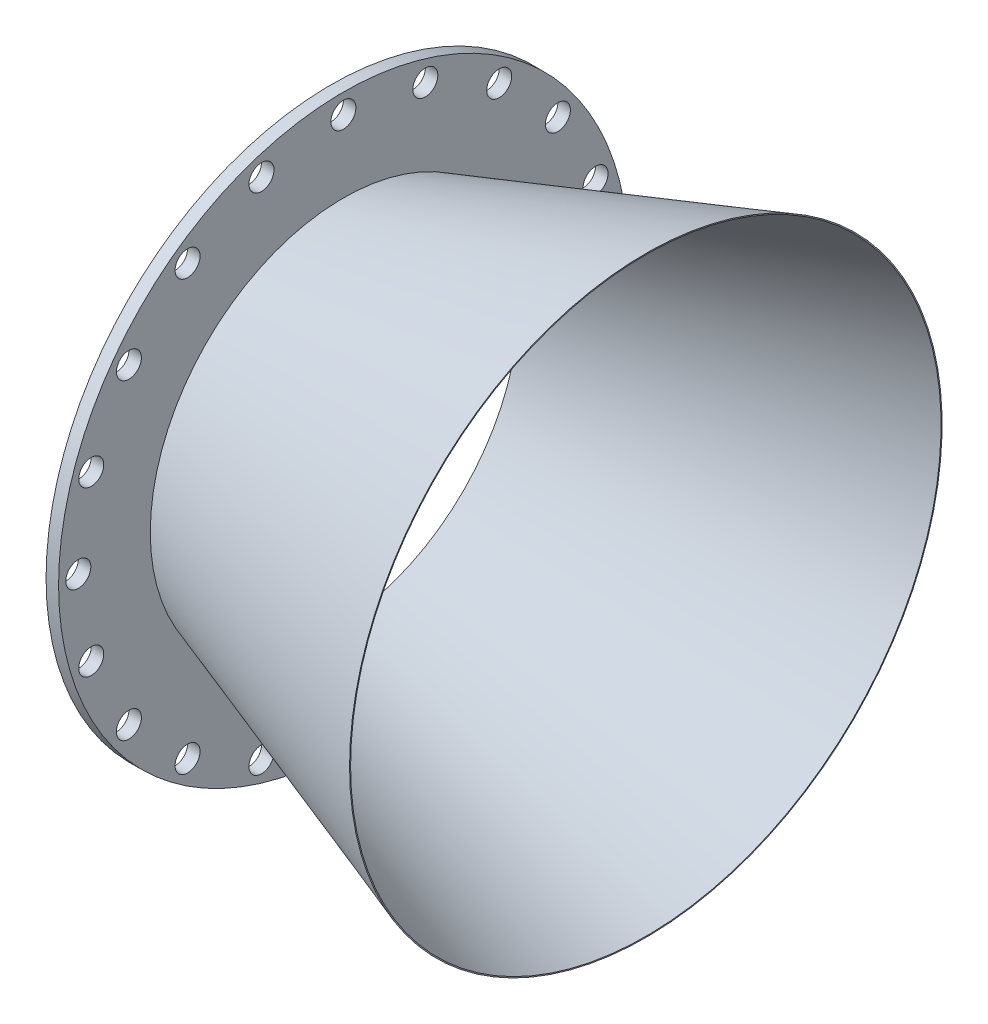
ISO-10303-21;
HEADER;
FILE_DESCRIPTION(('STEP AP214'),'2;1');
FILE_NAME('part.step','',(''),(''),'','','');
FILE_SCHEMA(('AUTOMOTIVE_DESIGN { 1 0 10303 214 1 1 1 1 }'));
ENDSEC;
DATA;
#1=APPLICATION_CONTEXT('core data for automotive mechanical design processes');
#2=APPLICATION_PROTOCOL_DEFINITION('international standard','automotive_design',2000,#1);
#3=PRODUCT_CONTEXT('',#1,'mechanical');
#4=PRODUCT('Part','Part','',(#3));
#5=PRODUCT_RELATED_PRODUCT_CATEGORY('part','',(#4));
#6=PRODUCT_DEFINITION_FORMATION('','',#4);
#7=PRODUCT_DEFINITION_CONTEXT('part definition',#1,'design');
#8=PRODUCT_DEFINITION('design','',#6,#7);
#9=PRODUCT_DEFINITION_SHAPE('','',#8);
#10=(LENGTH_UNIT() NAMED_UNIT(*) SI_UNIT(.MILLI.,.METRE.));
#11=(NAMED_UNIT(*) PLANE_ANGLE_UNIT() SI_UNIT($,.RADIAN.));
#12=(NAMED_UNIT(*) SI_UNIT($,.STERADIAN.) SOLID_ANGLE_UNIT());
#13=UNCERTAINTY_MEASURE_WITH_UNIT(LENGTH_MEASURE(1.E-05),#10,'distance_accuracy_value','');
#14=(GEOMETRIC_REPRESENTATION_CONTEXT(3) GLOBAL_UNCERTAINTY_ASSIGNED_CONTEXT((#13)) GLOBAL_UNIT_ASSIGNED_CONTEXT((#10,
#11,#12)) REPRESENTATION_CONTEXT('',''));
#15=CARTESIAN_POINT('',(0.,0.,0.));
#16=DIRECTION('',(0.,0.,1.));
#17=DIRECTION('',(1.,0.,0.));
#18=AXIS2_PLACEMENT_3D('',#15,#16,#17);
#19=CARTESIAN_POINT('',(79.9592,0.,0.));
#20=DIRECTION('',(1.,0.,0.));
#21=DIRECTION('',(0.,0.,-1.));
#22=AXIS2_PLACEMENT_3D('',#19,#20,#21);
#23=CONICAL_SURFACE('',#22,75.2237755254414,0.328785996406436);
#24=CARTESIAN_POINT('',(79.9592,0.,0.));
#25=DIRECTION('',(-1.,0.,0.));
#26=DIRECTION('',(0.,0.,1.));
#27=AXIS2_PLACEMENT_3D('',#24,#25,#26);
#28=CIRCLE('',#27,75.2237755254414);
#29=CARTESIAN_POINT('',(79.9592,0.,75.2237755254414));
#30=VERTEX_POINT('',#29);
#31=EDGE_CURVE('E41',#30,#30,#28,.T.);
#32=ORIENTED_EDGE('',*,*,#31,.T.);
#33=EDGE_LOOP('',(#32));
#34=FACE_BOUND('',#33,.T.);
#35=CARTESIAN_POINT('',(3.175,0.,0.));
#36=DIRECTION('',(-1.,0.,0.));
#37=DIRECTION('',(0.,0.,1.));
#38=AXIS2_PLACEMENT_3D('',#35,#36,#37);
#39=CIRCLE('',#38,49.0273870883385);
#40=CARTESIAN_POINT('',(3.175,0.,49.0273870883385));
#41=VERTEX_POINT('',#40);
#42=EDGE_CURVE('E10',#41,#41,#39,.T.);
#43=ORIENTED_EDGE('',*,*,#42,.F.);
#44=EDGE_LOOP('',(#43));
#45=FACE_BOUND('',#44,.T.);
#46=ADVANCED_FACE('F34',(#34,#45),#23,.T.);
#47=CARTESIAN_POINT('',(0.,47.6758,0.));
#48=DIRECTION('',(1.,0.,0.));
#49=DIRECTION('',(0.,0.,-1.));
#50=AXIS2_PLACEMENT_3D('',#47,#48,#49);
#51=PLANE('',#50);
#52=CARTESIAN_POINT('',(0.,20.7999338913742,-64.0156141118243));
#53=DIRECTION('',(-1.,0.,0.));
#54=DIRECTION('',(0.,0.,1.));
#55=AXIS2_PLACEMENT_3D('',#52,#53,#54);
#56=CIRCLE('',#55,3.175);
#57=CARTESIAN_POINT('',(0.,20.7999338913742,-60.8406141118243));
#58=VERTEX_POINT('',#57);
#59=EDGE_CURVE('E115',#58,#58,#56,.T.);
#60=ORIENTED_EDGE('',*,*,#59,.F.);
#61=EDGE_LOOP('',(#60));
#62=FACE_BOUND('',#61,.T.);
#63=CARTESIAN_POINT('',(0.,-3.67824881138597E-12,-67.3099999999963));
#64=DIRECTION('',(-1.,0.,0.));
#65=DIRECTION('',(0.,0.,1.));
#66=AXIS2_PLACEMENT_3D('',#63,#64,#65);
#67=CIRCLE('',#66,3.175);
#68=CARTESIAN_POINT('',(0.,-3.67824881138597E-12,-64.1349999999963));
#69=VERTEX_POINT('',#68);
#70=EDGE_CURVE('E123',#69,#69,#67,.T.);
#71=ORIENTED_EDGE('',*,*,#70,.F.);
#72=EDGE_LOOP('',(#71));
#73=FACE_BOUND('',#72,.T.);
#74=CARTESIAN_POINT('',(0.,-20.7999338913812,-64.015614111822));
#75=DIRECTION('',(-1.,0.,0.));
#76=DIRECTION('',(0.,0.,1.));
#77=AXIS2_PLACEMENT_3D('',#74,#75,#76);
#78=CIRCLE('',#77,3.175);
#79=CARTESIAN_POINT('',(0.,-20.7999338913812,-60.840614111822));
#80=VERTEX_POINT('',#79);
#81=EDGE_CURVE('E129',#80,#80,#78,.T.);
#82=ORIENTED_EDGE('',*,*,#81,.F.);
#83=EDGE_LOOP('',(#82));
#84=FACE_BOUND('',#83,.T.);
#85=CARTESIAN_POINT('',(0.,-39.5638253318093,-54.4549338913719));
#86=DIRECTION('',(-1.,0.,0.));
#87=DIRECTION('',(0.,0.,1.));
#88=AXIS2_PLACEMENT_3D('',#85,#86,#87);
#89=CIRCLE('',#88,3.175);
#90=CARTESIAN_POINT('',(0.,-39.5638253318093,-51.2799338913719));
#91=VERTEX_POINT('',#90);
#92=EDGE_CURVE('E135',#91,#91,#89,.T.);
#93=ORIENTED_EDGE('',*,*,#92,.F.);
#94=EDGE_LOOP('',(#93));
#95=FACE_BOUND('',#94,.T.);
#96=CARTESIAN_POINT('',(0.,-54.4549338913799,-39.5638253317997));
#97=DIRECTION('',(-1.,0.,0.));
#98=DIRECTION('',(0.,0.,1.));
#99=AXIS2_PLACEMENT_3D('',#96,#97,#98);
#100=CIRCLE('',#99,3.175);
#101=CARTESIAN_POINT('',(0.,-54.4549338913799,-36.3888253317997));
#102=VERTEX_POINT('',#101);
#103=EDGE_CURVE('E141',#102,#102,#100,.T.);
#104=ORIENTED_EDGE('',*,*,#103,.F.);
#105=EDGE_LOOP('',(#104));
#106=FACE_BOUND('',#105,.T.);
#107=CARTESIAN_POINT('',(0.,-64.0156141118279,-20.7999338913705));
#108=DIRECTION('',(-1.,0.,0.));
#109=DIRECTION('',(0.,0.,1.));
#110=AXIS2_PLACEMENT_3D('',#107,#108,#109);
#111=CIRCLE('',#110,3.175);
#112=CARTESIAN_POINT('',(0.,-64.0156141118279,-17.6249338913705));
#113=VERTEX_POINT('',#112);
#114=EDGE_CURVE('E147',#113,#113,#111,.T.);
#115=ORIENTED_EDGE('',*,*,#114,.F.);
#116=EDGE_LOOP('',(#115));
#117=FACE_BOUND('',#116,.T.);
#118=CARTESIAN_POINT('',(0.,-67.31,7.34001142756182E-12));
#119=DIRECTION('',(-1.,0.,0.));
#120=DIRECTION('',(0.,0.,1.));
#121=AXIS2_PLACEMENT_3D('',#118,#119,#120);
#122=CIRCLE('',#121,3.175);
#123=CARTESIAN_POINT('',(0.,-67.31,3.17500000000734));
#124=VERTEX_POINT('',#123);
#125=EDGE_CURVE('E153',#124,#124,#122,.T.);
#126=ORIENTED_EDGE('',*,*,#125,.F.);
#127=EDGE_LOOP('',(#126));
#128=FACE_BOUND('',#127,.T.);
#129=CARTESIAN_POINT('',(0.,-64.0156141118256,20.7999338913849));
#130=DIRECTION('',(-1.,0.,0.));
#131=DIRECTION('',(0.,0.,1.));
#132=AXIS2_PLACEMENT_3D('',#129,#130,#131);
#133=CIRCLE('',#132,3.175);
#134=CARTESIAN_POINT('',(0.,-64.0156141118256,23.9749338913849));
#135=VERTEX_POINT('',#134);
#136=EDGE_CURVE('E74',#135,#135,#133,.T.);
#137=ORIENTED_EDGE('',*,*,#136,.F.);
#138=EDGE_LOOP('',(#137));
#139=FACE_BOUND('',#138,.T.);
#140=CARTESIAN_POINT('',(0.,-54.4549338913755,39.563825331813));
#141=DIRECTION('',(-1.,0.,0.));
#142=DIRECTION('',(0.,0.,1.));
#143=AXIS2_PLACEMENT_3D('',#140,#141,#142);
#144=CIRCLE('',#143,3.175);
#145=CARTESIAN_POINT('',(0.,-54.4549338913755,42.738825331813));
#146=VERTEX_POINT('',#145);
#147=EDGE_CURVE('E67',#146,#146,#144,.T.);
#148=ORIENTED_EDGE('',*,*,#147,.F.);
#149=EDGE_LOOP('',(#148));
#150=FACE_BOUND('',#149,.T.);
#151=CARTESIAN_POINT('',(0.,-39.5638253318034,54.4549338913835));
#152=DIRECTION('',(-1.,0.,0.));
#153=DIRECTION('',(0.,0.,1.));
#154=AXIS2_PLACEMENT_3D('',#151,#152,#153);
#155=CIRCLE('',#154,3.175);
#156=CARTESIAN_POINT('',(0.,-39.5638253318034,57.6299338913835));
#157=VERTEX_POINT('',#156);
#158=EDGE_CURVE('E75',#157,#157,#155,.T.);
#159=ORIENTED_EDGE('',*,*,#158,.F.);
#160=EDGE_LOOP('',(#159));
#161=FACE_BOUND('',#160,.T.);
#162=CARTESIAN_POINT('',(0.,-20.7999338913742,64.0156141118316));
#163=DIRECTION('',(-1.,0.,0.));
#164=DIRECTION('',(0.,0.,1.));
#165=AXIS2_PLACEMENT_3D('',#162,#163,#164);
#166=CIRCLE('',#165,3.175);
#167=CARTESIAN_POINT('',(0.,-20.7999338913742,67.1906141118316));
#168=VERTEX_POINT('',#167);
#169=EDGE_CURVE('E81',#168,#168,#166,.T.);
#170=ORIENTED_EDGE('',*,*,#169,.F.);
#171=EDGE_LOOP('',(#170));
#172=FACE_BOUND('',#171,.T.);
#173=CARTESIAN_POINT('',(0.,3.67000571378091E-12,67.3100000000037));
#174=DIRECTION('',(-1.,0.,0.));
#175=DIRECTION('',(0.,0.,1.));
#176=AXIS2_PLACEMENT_3D('',#173,#174,#175);
#177=CIRCLE('',#176,3.175);
#178=CARTESIAN_POINT('',(0.,3.67000571378091E-12,70.4850000000037));
#179=VERTEX_POINT('',#178);
#180=EDGE_CURVE('E87',#179,#179,#177,.T.);
#181=ORIENTED_EDGE('',*,*,#180,.F.);
#182=EDGE_LOOP('',(#181));
#183=FACE_BOUND('',#182,.T.);
#184=CARTESIAN_POINT('',(0.,20.7999338913812,64.0156141118293));
#185=DIRECTION('',(-1.,0.,0.));
#186=DIRECTION('',(0.,0.,1.));
#187=AXIS2_PLACEMENT_3D('',#184,#185,#186);
#188=CIRCLE('',#187,3.17500000000001);
#189=CARTESIAN_POINT('',(0.,20.7999338913812,67.1906141118293));
#190=VERTEX_POINT('',#189);
#191=EDGE_CURVE('E93',#190,#190,#188,.T.);
#192=ORIENTED_EDGE('',*,*,#191,.F.);
#193=EDGE_LOOP('',(#192));
#194=FACE_BOUND('',#193,.T.);
#195=CARTESIAN_POINT('',(0.,39.5638253318093,54.4549338913792));
#196=DIRECTION('',(-1.,0.,0.));
#197=DIRECTION('',(0.,0.,1.));
#198=AXIS2_PLACEMENT_3D('',#195,#196,#197);
#199=CIRCLE('',#198,3.175);
#200=CARTESIAN_POINT('',(0.,39.5638253318093,57.6299338913792));
#201=VERTEX_POINT('',#200);
#202=EDGE_CURVE('E99',#201,#201,#199,.T.);
#203=ORIENTED_EDGE('',*,*,#202,.F.);
#204=EDGE_LOOP('',(#203));
#205=FACE_BOUND('',#204,.T.);
#206=CARTESIAN_POINT('',(0.,54.4549338913799,39.5638253318071));
#207=DIRECTION('',(-1.,0.,0.));
#208=DIRECTION('',(0.,0.,1.));
#209=AXIS2_PLACEMENT_3D('',#206,#207,#208);
#210=CIRCLE('',#209,3.175);
#211=CARTESIAN_POINT('',(0.,54.4549338913799,42.7388253318071));
#212=VERTEX_POINT('',#211);
#213=EDGE_CURVE('E105',#212,#212,#210,.T.);
#214=ORIENTED_EDGE('',*,*,#213,.F.);
#215=EDGE_LOOP('',(#214));
#216=FACE_BOUND('',#215,.T.);
#217=CARTESIAN_POINT('',(0.,64.0156141118279,20.7999338913779));
#218=DIRECTION('',(-1.,0.,0.));
#219=DIRECTION('',(0.,0.,1.));
#220=AXIS2_PLACEMENT_3D('',#217,#218,#219);
#221=CIRCLE('',#220,3.175);
#222=CARTESIAN_POINT('',(0.,64.0156141118279,23.9749338913779));
#223=VERTEX_POINT('',#222);
#224=EDGE_CURVE('E66',#223,#223,#221,.T.);
#225=ORIENTED_EDGE('',*,*,#224,.F.);
#226=EDGE_LOOP('',(#225));
#227=FACE_BOUND('',#226,.T.);
#228=CARTESIAN_POINT('',(0.,39.5638253318034,-54.4549338913762));
#229=DIRECTION('',(-1.,0.,0.));
#230=DIRECTION('',(0.,0.,1.));
#231=AXIS2_PLACEMENT_3D('',#228,#229,#230);
#232=CIRCLE('',#231,3.175);
#233=CARTESIAN_POINT('',(0.,39.5638253318034,-51.2799338913762));
#234=VERTEX_POINT('',#233);
#235=EDGE_CURVE('E122',#234,#234,#232,.T.);
#236=ORIENTED_EDGE('',*,*,#235,.F.);
#237=EDGE_LOOP('',(#236));
#238=FACE_BOUND('',#237,.T.);
#239=CARTESIAN_POINT('',(0.,54.4549338913755,-39.5638253318057));
#240=DIRECTION('',(-1.,0.,0.));
#241=DIRECTION('',(0.,0.,1.));
#242=AXIS2_PLACEMENT_3D('',#239,#240,#241);
#243=CIRCLE('',#242,3.175);
#244=CARTESIAN_POINT('',(0.,54.4549338913755,-36.3888253318057));
#245=VERTEX_POINT('',#244);
#246=EDGE_CURVE('E170',#245,#245,#243,.T.);
#247=ORIENTED_EDGE('',*,*,#246,.F.);
#248=EDGE_LOOP('',(#247));
#249=FACE_BOUND('',#248,.T.);
#250=CARTESIAN_POINT('',(0.,64.0156141118256,-20.7999338913775));
#251=DIRECTION('',(-1.,0.,0.));
#252=DIRECTION('',(0.,0.,1.));
#253=AXIS2_PLACEMENT_3D('',#250,#251,#252);
#254=CIRCLE('',#253,3.175);
#255=CARTESIAN_POINT('',(0.,64.0156141118256,-17.6249338913775));
#256=VERTEX_POINT('',#255);
#257=EDGE_CURVE('E163',#256,#256,#254,.T.);
#258=ORIENTED_EDGE('',*,*,#257,.F.);
#259=EDGE_LOOP('',(#258));
#260=FACE_BOUND('',#259,.T.);
#261=CARTESIAN_POINT('',(0.,67.31,0.));
#262=DIRECTION('',(-1.,0.,0.));
#263=DIRECTION('',(0.,0.,1.));
#264=AXIS2_PLACEMENT_3D('',#261,#262,#263);
#265=CIRCLE('',#264,3.175);
#266=CARTESIAN_POINT('',(0.,67.31,3.175));
#267=VERTEX_POINT('',#266);
#268=EDGE_CURVE('E60',#267,#267,#265,.T.);
#269=ORIENTED_EDGE('',*,*,#268,.F.);
#270=EDGE_LOOP('',(#269));
#271=FACE_BOUND('',#270,.T.);
#272=CARTESIAN_POINT('',(0.,0.,0.));
#273=DIRECTION('',(-1.,0.,0.));
#274=DIRECTION('',(0.,0.,1.));
#275=AXIS2_PLACEMENT_3D('',#272,#273,#274);
#276=CIRCLE('',#275,47.6758);
#277=CARTESIAN_POINT('',(0.,0.,47.6758));
#278=VERTEX_POINT('',#277);
#279=EDGE_CURVE('E49',#278,#278,#276,.T.);
#280=ORIENTED_EDGE('',*,*,#279,.F.);
#281=EDGE_LOOP('',(#280));
#282=FACE_BOUND('',#281,.T.);
#283=CARTESIAN_POINT('',(0.,0.,0.));
#284=DIRECTION('',(-1.,0.,0.));
#285=DIRECTION('',(0.,0.,1.));
#286=AXIS2_PLACEMENT_3D('',#283,#284,#285);
#287=CIRCLE('',#286,72.3138);
#288=CARTESIAN_POINT('',(0.,0.,72.3138));
#289=VERTEX_POINT('',#288);
#290=EDGE_CURVE('E54',#289,#289,#287,.T.);
#291=ORIENTED_EDGE('',*,*,#290,.T.);
#292=EDGE_LOOP('',(#291));
#293=FACE_BOUND('',#292,.T.);
#294=ADVANCED_FACE('F36',(#62,#73,#84,#95,#106,#117,#128,#139,#150,#161,#172,#183,#194,#205,
#216,#227,#238,#249,#260,#271,#282,#293),#51,.F.);
#295=CARTESIAN_POINT('',(79.9592,74.9554,0.));
#296=DIRECTION('',(-1.,0.,0.));
#297=DIRECTION('',(0.,0.,1.));
#298=AXIS2_PLACEMENT_3D('',#295,#296,#297);
#299=PLANE('',#298);
#300=ORIENTED_EDGE('',*,*,#31,.F.);
#301=EDGE_LOOP('',(#300));
#302=FACE_BOUND('',#301,.T.);
#303=CARTESIAN_POINT('',(79.9592,0.,0.));
#304=DIRECTION('',(-1.,0.,0.));
#305=DIRECTION('',(0.,0.,1.));
#306=AXIS2_PLACEMENT_3D('',#303,#304,#305);
#307=CIRCLE('',#306,74.9554);
#308=CARTESIAN_POINT('',(79.9592,0.,74.9554));
#309=VERTEX_POINT('',#308);
#310=EDGE_CURVE('E45',#309,#309,#307,.T.);
#311=ORIENTED_EDGE('',*,*,#310,.T.);
#312=EDGE_LOOP('',(#311));
#313=FACE_BOUND('',#312,.T.);
#314=ADVANCED_FACE('F205',(#302,#313),#299,.F.);
#315=CARTESIAN_POINT('',(0.,0.,0.));
#316=DIRECTION('',(1.,0.,0.));
#317=DIRECTION('',(0.,0.,-1.));
#318=AXIS2_PLACEMENT_3D('',#315,#316,#317);
#319=CONICAL_SURFACE('',#318,47.6758,0.328785996406436);
#320=ORIENTED_EDGE('',*,*,#310,.F.);
#321=EDGE_LOOP('',(#320));
#322=FACE_BOUND('',#321,.T.);
#323=ORIENTED_EDGE('',*,*,#279,.T.);
#324=EDGE_LOOP('',(#323));
#325=FACE_BOUND('',#324,.T.);
#326=ADVANCED_FACE('F199',(#322,#325),#319,.F.);
#327=CARTESIAN_POINT('',(0.,0.,0.));
#328=DIRECTION('',(-1.,0.,0.));
#329=DIRECTION('',(0.,0.,1.));
#330=AXIS2_PLACEMENT_3D('',#327,#328,#329);
#331=CYLINDRICAL_SURFACE('',#330,72.3138);
#332=ORIENTED_EDGE('',*,*,#290,.F.);
#333=EDGE_LOOP('',(#332));
#334=FACE_BOUND('',#333,.T.);
#335=CARTESIAN_POINT('',(3.175,0.,0.));
#336=DIRECTION('',(-1.,0.,0.));
#337=DIRECTION('',(0.,0.,1.));
#338=AXIS2_PLACEMENT_3D('',#335,#336,#337);
#339=CIRCLE('',#338,72.3138);
#340=CARTESIAN_POINT('',(3.175,0.,72.3138));
#341=VERTEX_POINT('',#340);
#342=EDGE_CURVE('E57',#341,#341,#339,.T.);
#343=ORIENTED_EDGE('',*,*,#342,.T.);
#344=EDGE_LOOP('',(#343));
#345=FACE_BOUND('',#344,.T.);
#346=ADVANCED_FACE('F187',(#334,#345),#331,.T.);
#347=CARTESIAN_POINT('',(3.175,49.0273870883385,0.));
#348=DIRECTION('',(-1.,0.,0.));
#349=DIRECTION('',(0.,0.,1.));
#350=AXIS2_PLACEMENT_3D('',#347,#348,#349);
#351=PLANE('',#350);
#352=CARTESIAN_POINT('',(3.175,20.7999338913742,-64.0156141118243));
#353=DIRECTION('',(-1.,0.,0.));
#354=DIRECTION('',(0.,0.,1.));
#355=AXIS2_PLACEMENT_3D('',#352,#353,#354);
#356=CIRCLE('',#355,3.175);
#357=CARTESIAN_POINT('',(3.175,20.7999338913742,-60.8406141118243));
#358=VERTEX_POINT('',#357);
#359=EDGE_CURVE('E119',#358,#358,#356,.F.);
#360=ORIENTED_EDGE('',*,*,#359,.F.);
#361=EDGE_LOOP('',(#360));
#362=FACE_BOUND('',#361,.T.);
#363=CARTESIAN_POINT('',(3.175,-3.67824881138597E-12,-67.3099999999963));
#364=DIRECTION('',(-1.,0.,0.));
#365=DIRECTION('',(0.,0.,1.));
#366=AXIS2_PLACEMENT_3D('',#363,#364,#365);
#367=CIRCLE('',#366,3.175);
#368=CARTESIAN_POINT('',(3.175,-3.67824881138597E-12,-64.1349999999963));
#369=VERTEX_POINT('',#368);
#370=EDGE_CURVE('E118',#369,#369,#367,.F.);
#371=ORIENTED_EDGE('',*,*,#370,.F.);
#372=EDGE_LOOP('',(#371));
#373=FACE_BOUND('',#372,.T.);
#374=CARTESIAN_POINT('',(3.175,-20.7999338913812,-64.015614111822));
#375=DIRECTION('',(-1.,0.,0.));
#376=DIRECTION('',(0.,0.,1.));
#377=AXIS2_PLACEMENT_3D('',#374,#375,#376);
#378=CIRCLE('',#377,3.175);
#379=CARTESIAN_POINT('',(3.175,-20.7999338913812,-60.840614111822));
#380=VERTEX_POINT('',#379);
#381=EDGE_CURVE('E126',#380,#380,#378,.F.);
#382=ORIENTED_EDGE('',*,*,#381,.F.);
#383=EDGE_LOOP('',(#382));
#384=FACE_BOUND('',#383,.T.);
#385=CARTESIAN_POINT('',(3.175,-39.5638253318093,-54.4549338913719));
#386=DIRECTION('',(-1.,0.,0.));
#387=DIRECTION('',(0.,0.,1.));
#388=AXIS2_PLACEMENT_3D('',#385,#386,#387);
#389=CIRCLE('',#388,3.175);
#390=CARTESIAN_POINT('',(3.175,-39.5638253318093,-51.2799338913719));
#391=VERTEX_POINT('',#390);
#392=EDGE_CURVE('E132',#391,#391,#389,.F.);
#393=ORIENTED_EDGE('',*,*,#392,.F.);
#394=EDGE_LOOP('',(#393));
#395=FACE_BOUND('',#394,.T.);
#396=CARTESIAN_POINT('',(3.175,-54.4549338913799,-39.5638253317997));
#397=DIRECTION('',(-1.,0.,0.));
#398=DIRECTION('',(0.,0.,1.));
#399=AXIS2_PLACEMENT_3D('',#396,#397,#398);
#400=CIRCLE('',#399,3.175);
#401=CARTESIAN_POINT('',(3.175,-54.4549338913799,-36.3888253317997));
#402=VERTEX_POINT('',#401);
#403=EDGE_CURVE('E138',#402,#402,#400,.F.);
#404=ORIENTED_EDGE('',*,*,#403,.F.);
#405=EDGE_LOOP('',(#404));
#406=FACE_BOUND('',#405,.T.);
#407=CARTESIAN_POINT('',(3.175,-64.0156141118279,-20.7999338913705));
#408=DIRECTION('',(-1.,0.,0.));
#409=DIRECTION('',(0.,0.,1.));
#410=AXIS2_PLACEMENT_3D('',#407,#408,#409);
#411=CIRCLE('',#410,3.175);
#412=CARTESIAN_POINT('',(3.175,-64.0156141118279,-17.6249338913705));
#413=VERTEX_POINT('',#412);
#414=EDGE_CURVE('E144',#413,#413,#411,.F.);
#415=ORIENTED_EDGE('',*,*,#414,.F.);
#416=EDGE_LOOP('',(#415));
#417=FACE_BOUND('',#416,.T.);
#418=CARTESIAN_POINT('',(3.175,-67.31,7.34001142756182E-12));
#419=DIRECTION('',(-1.,0.,0.));
#420=DIRECTION('',(0.,0.,1.));
#421=AXIS2_PLACEMENT_3D('',#418,#419,#420);
#422=CIRCLE('',#421,3.175);
#423=CARTESIAN_POINT('',(3.175,-67.31,3.17500000000734));
#424=VERTEX_POINT('',#423);
#425=EDGE_CURVE('E150',#424,#424,#422,.F.);
#426=ORIENTED_EDGE('',*,*,#425,.F.);
#427=EDGE_LOOP('',(#426));
#428=FACE_BOUND('',#427,.T.);
#429=CARTESIAN_POINT('',(3.175,-64.0156141118256,20.7999338913849));
#430=DIRECTION('',(-1.,0.,0.));
#431=DIRECTION('',(0.,0.,1.));
#432=AXIS2_PLACEMENT_3D('',#429,#430,#431);
#433=CIRCLE('',#432,3.175);
#434=CARTESIAN_POINT('',(3.175,-64.0156141118256,23.9749338913849));
#435=VERTEX_POINT('',#434);
#436=EDGE_CURVE('E156',#435,#435,#433,.F.);
#437=ORIENTED_EDGE('',*,*,#436,.F.);
#438=EDGE_LOOP('',(#437));
#439=FACE_BOUND('',#438,.T.);
#440=CARTESIAN_POINT('',(3.175,-54.4549338913755,39.563825331813));
#441=DIRECTION('',(-1.,0.,0.));
#442=DIRECTION('',(0.,0.,1.));
#443=AXIS2_PLACEMENT_3D('',#440,#441,#442);
#444=CIRCLE('',#443,3.175);
#445=CARTESIAN_POINT('',(3.175,-54.4549338913755,42.738825331813));
#446=VERTEX_POINT('',#445);
#447=EDGE_CURVE('E71',#446,#446,#444,.F.);
#448=ORIENTED_EDGE('',*,*,#447,.F.);
#449=EDGE_LOOP('',(#448));
#450=FACE_BOUND('',#449,.T.);
#451=CARTESIAN_POINT('',(3.175,-39.5638253318034,54.4549338913835));
#452=DIRECTION('',(-1.,0.,0.));
#453=DIRECTION('',(0.,0.,1.));
#454=AXIS2_PLACEMENT_3D('',#451,#452,#453);
#455=CIRCLE('',#454,3.175);
#456=CARTESIAN_POINT('',(3.175,-39.5638253318034,57.6299338913835));
#457=VERTEX_POINT('',#456);
#458=EDGE_CURVE('E70',#457,#457,#455,.F.);
#459=ORIENTED_EDGE('',*,*,#458,.F.);
#460=EDGE_LOOP('',(#459));
#461=FACE_BOUND('',#460,.T.);
#462=CARTESIAN_POINT('',(3.175,-20.7999338913742,64.0156141118316));
#463=DIRECTION('',(-1.,0.,0.));
#464=DIRECTION('',(0.,0.,1.));
#465=AXIS2_PLACEMENT_3D('',#462,#463,#464);
#466=CIRCLE('',#465,3.175);
#467=CARTESIAN_POINT('',(3.175,-20.7999338913742,67.1906141118316));
#468=VERTEX_POINT('',#467);
#469=EDGE_CURVE('E78',#468,#468,#466,.F.);
#470=ORIENTED_EDGE('',*,*,#469,.F.);
#471=EDGE_LOOP('',(#470));
#472=FACE_BOUND('',#471,.T.);
#473=CARTESIAN_POINT('',(3.175,3.67000571378091E-12,67.3100000000037));
#474=DIRECTION('',(-1.,0.,0.));
#475=DIRECTION('',(0.,0.,1.));
#476=AXIS2_PLACEMENT_3D('',#473,#474,#475);
#477=CIRCLE('',#476,3.175);
#478=CARTESIAN_POINT('',(3.175,3.67000571378091E-12,70.4850000000037));
#479=VERTEX_POINT('',#478);
#480=EDGE_CURVE('E84',#479,#479,#477,.F.);
#481=ORIENTED_EDGE('',*,*,#480,.F.);
#482=EDGE_LOOP('',(#481));
#483=FACE_BOUND('',#482,.T.);
#484=CARTESIAN_POINT('',(3.175,20.7999338913812,64.0156141118293));
#485=DIRECTION('',(-1.,0.,0.));
#486=DIRECTION('',(0.,0.,1.));
#487=AXIS2_PLACEMENT_3D('',#484,#485,#486);
#488=CIRCLE('',#487,3.17500000000001);
#489=CARTESIAN_POINT('',(3.175,20.7999338913812,67.1906141118293));
#490=VERTEX_POINT('',#489);
#491=EDGE_CURVE('E90',#490,#490,#488,.F.);
#492=ORIENTED_EDGE('',*,*,#491,.F.);
#493=EDGE_LOOP('',(#492));
#494=FACE_BOUND('',#493,.T.);
#495=CARTESIAN_POINT('',(3.175,39.5638253318093,54.4549338913792));
#496=DIRECTION('',(-1.,0.,0.));
#497=DIRECTION('',(0.,0.,1.));
#498=AXIS2_PLACEMENT_3D('',#495,#496,#497);
#499=CIRCLE('',#498,3.175);
#500=CARTESIAN_POINT('',(3.175,39.5638253318093,57.6299338913792));
#501=VERTEX_POINT('',#500);
#502=EDGE_CURVE('E96',#501,#501,#499,.F.);
#503=ORIENTED_EDGE('',*,*,#502,.F.);
#504=EDGE_LOOP('',(#503));
#505=FACE_BOUND('',#504,.T.);
#506=CARTESIAN_POINT('',(3.175,54.4549338913799,39.5638253318071));
#507=DIRECTION('',(-1.,0.,0.));
#508=DIRECTION('',(0.,0.,1.));
#509=AXIS2_PLACEMENT_3D('',#506,#507,#508);
#510=CIRCLE('',#509,3.175);
#511=CARTESIAN_POINT('',(3.175,54.4549338913799,42.7388253318071));
#512=VERTEX_POINT('',#511);
#513=EDGE_CURVE('E102',#512,#512,#510,.F.);
#514=ORIENTED_EDGE('',*,*,#513,.F.);
#515=EDGE_LOOP('',(#514));
#516=FACE_BOUND('',#515,.T.);
#517=CARTESIAN_POINT('',(3.175,64.0156141118279,20.7999338913779));
#518=DIRECTION('',(-1.,0.,0.));
#519=DIRECTION('',(0.,0.,1.));
#520=AXIS2_PLACEMENT_3D('',#517,#518,#519);
#521=CIRCLE('',#520,3.175);
#522=CARTESIAN_POINT('',(3.175,64.0156141118279,23.9749338913779));
#523=VERTEX_POINT('',#522);
#524=EDGE_CURVE('E108',#523,#523,#521,.F.);
#525=ORIENTED_EDGE('',*,*,#524,.F.);
#526=EDGE_LOOP('',(#525));
#527=FACE_BOUND('',#526,.T.);
#528=CARTESIAN_POINT('',(3.175,39.5638253318034,-54.4549338913762));
#529=DIRECTION('',(-1.,0.,0.));
#530=DIRECTION('',(0.,0.,1.));
#531=AXIS2_PLACEMENT_3D('',#528,#529,#530);
#532=CIRCLE('',#531,3.175);
#533=CARTESIAN_POINT('',(3.175,39.5638253318034,-51.2799338913762));
#534=VERTEX_POINT('',#533);
#535=EDGE_CURVE('E173',#534,#534,#532,.F.);
#536=ORIENTED_EDGE('',*,*,#535,.F.);
#537=EDGE_LOOP('',(#536));
#538=FACE_BOUND('',#537,.T.);
#539=CARTESIAN_POINT('',(3.175,54.4549338913755,-39.5638253318057));
#540=DIRECTION('',(-1.,0.,0.));
#541=DIRECTION('',(0.,0.,1.));
#542=AXIS2_PLACEMENT_3D('',#539,#540,#541);
#543=CIRCLE('',#542,3.175);
#544=CARTESIAN_POINT('',(3.175,54.4549338913755,-36.3888253318057));
#545=VERTEX_POINT('',#544);
#546=EDGE_CURVE('E166',#545,#545,#543,.F.);
#547=ORIENTED_EDGE('',*,*,#546,.F.);
#548=EDGE_LOOP('',(#547));
#549=FACE_BOUND('',#548,.T.);
#550=CARTESIAN_POINT('',(3.175,64.0156141118256,-20.7999338913775));
#551=DIRECTION('',(-1.,0.,0.));
#552=DIRECTION('',(0.,0.,1.));
#553=AXIS2_PLACEMENT_3D('',#550,#551,#552);
#554=CIRCLE('',#553,3.175);
#555=CARTESIAN_POINT('',(3.175,64.0156141118256,-17.6249338913775));
#556=VERTEX_POINT('',#555);
#557=EDGE_CURVE('E167',#556,#556,#554,.F.);
#558=ORIENTED_EDGE('',*,*,#557,.F.);
#559=EDGE_LOOP('',(#558));
#560=FACE_BOUND('',#559,.T.);
#561=CARTESIAN_POINT('',(3.175,67.31,0.));
#562=DIRECTION('',(-1.,0.,0.));
#563=DIRECTION('',(0.,0.,1.));
#564=AXIS2_PLACEMENT_3D('',#561,#562,#563);
#565=CIRCLE('',#564,3.175);
#566=CARTESIAN_POINT('',(3.175,67.31,3.175));
#567=VERTEX_POINT('',#566);
#568=EDGE_CURVE('E63',#567,#567,#565,.F.);
#569=ORIENTED_EDGE('',*,*,#568,.F.);
#570=EDGE_LOOP('',(#569));
#571=FACE_BOUND('',#570,.T.);
#572=ORIENTED_EDGE('',*,*,#342,.F.);
#573=EDGE_LOOP('',(#572));
#574=FACE_BOUND('',#573,.T.);
#575=ORIENTED_EDGE('',*,*,#42,.T.);
#576=EDGE_LOOP('',(#575));
#577=FACE_BOUND('',#576,.T.);
#578=ADVANCED_FACE('F183',(#362,#373,#384,#395,#406,#417,#428,#439,#450,#461,#472,#483,#494,
#505,#516,#527,#538,#549,#560,#571,#574,#577),#351,.F.);
#579=CARTESIAN_POINT('',(79.9602,67.31,0.));
#580=DIRECTION('',(-1.,0.,0.));
#581=DIRECTION('',(0.,0.,1.));
#582=AXIS2_PLACEMENT_3D('',#579,#580,#581);
#583=CYLINDRICAL_SURFACE('',#582,3.175);
#584=ORIENTED_EDGE('',*,*,#268,.T.);
#585=EDGE_LOOP('',(#584));
#586=FACE_BOUND('',#585,.T.);
#587=ORIENTED_EDGE('',*,*,#568,.T.);
#588=EDGE_LOOP('',(#587));
#589=FACE_BOUND('',#588,.T.);
#590=ADVANCED_FACE('F186',(#586,#589),#583,.F.);
#591=CARTESIAN_POINT('',(79.9602,64.0156141118256,-20.7999338913775));
#592=DIRECTION('',(-1.,0.,0.));
#593=DIRECTION('',(0.,0.,1.));
#594=AXIS2_PLACEMENT_3D('',#591,#592,#593);
#595=CYLINDRICAL_SURFACE('',#594,3.175);
#596=ORIENTED_EDGE('',*,*,#257,.T.);
#597=EDGE_LOOP('',(#596));
#598=FACE_BOUND('',#597,.T.);
#599=ORIENTED_EDGE('',*,*,#557,.T.);
#600=EDGE_LOOP('',(#599));
#601=FACE_BOUND('',#600,.T.);
#602=ADVANCED_FACE('F262',(#598,#601),#595,.F.);
#603=CARTESIAN_POINT('',(79.9602,54.4549338913755,-39.5638253318057));
#604=DIRECTION('',(-1.,0.,0.));
#605=DIRECTION('',(0.,0.,1.));
#606=AXIS2_PLACEMENT_3D('',#603,#604,#605);
#607=CYLINDRICAL_SURFACE('',#606,3.175);
#608=ORIENTED_EDGE('',*,*,#246,.T.);
#609=EDGE_LOOP('',(#608));
#610=FACE_BOUND('',#609,.T.);
#611=ORIENTED_EDGE('',*,*,#546,.T.);
#612=EDGE_LOOP('',(#611));
#613=FACE_BOUND('',#612,.T.);
#614=ADVANCED_FACE('F272',(#610,#613),#607,.F.);
#615=CARTESIAN_POINT('',(79.9602,39.5638253318034,-54.4549338913762));
#616=DIRECTION('',(-1.,0.,0.));
#617=DIRECTION('',(0.,0.,1.));
#618=AXIS2_PLACEMENT_3D('',#615,#616,#617);
#619=CYLINDRICAL_SURFACE('',#618,3.175);
#620=ORIENTED_EDGE('',*,*,#235,.T.);
#621=EDGE_LOOP('',(#620));
#622=FACE_BOUND('',#621,.T.);
#623=ORIENTED_EDGE('',*,*,#535,.T.);
#624=EDGE_LOOP('',(#623));
#625=FACE_BOUND('',#624,.T.);
#626=ADVANCED_FACE('F181',(#622,#625),#619,.F.);
#627=CARTESIAN_POINT('',(79.9602,64.0156141118279,20.7999338913779));
#628=DIRECTION('',(-1.,0.,0.));
#629=DIRECTION('',(0.,0.,1.));
#630=AXIS2_PLACEMENT_3D('',#627,#628,#629);
#631=CYLINDRICAL_SURFACE('',#630,3.175);
#632=ORIENTED_EDGE('',*,*,#224,.T.);
#633=EDGE_LOOP('',(#632));
#634=FACE_BOUND('',#633,.T.);
#635=ORIENTED_EDGE('',*,*,#524,.T.);
#636=EDGE_LOOP('',(#635));
#637=FACE_BOUND('',#636,.T.);
#638=ADVANCED_FACE('F291',(#634,#637),#631,.F.);
#639=CARTESIAN_POINT('',(79.9602,54.4549338913799,39.5638253318071));
#640=DIRECTION('',(-1.,0.,0.));
#641=DIRECTION('',(0.,0.,1.));
#642=AXIS2_PLACEMENT_3D('',#639,#640,#641);
#643=CYLINDRICAL_SURFACE('',#642,3.175);
#644=ORIENTED_EDGE('',*,*,#213,.T.);
#645=EDGE_LOOP('',(#644));
#646=FACE_BOUND('',#645,.T.);
#647=ORIENTED_EDGE('',*,*,#513,.T.);
#648=EDGE_LOOP('',(#647));
#649=FACE_BOUND('',#648,.T.);
#650=ADVANCED_FACE('F301',(#646,#649),#643,.F.);
#651=CARTESIAN_POINT('',(79.9602,39.5638253318093,54.4549338913792));
#652=DIRECTION('',(-1.,0.,0.));
#653=DIRECTION('',(0.,0.,1.));
#654=AXIS2_PLACEMENT_3D('',#651,#652,#653);
#655=CYLINDRICAL_SURFACE('',#654,3.175);
#656=ORIENTED_EDGE('',*,*,#202,.T.);
#657=EDGE_LOOP('',(#656));
#658=FACE_BOUND('',#657,.T.);
#659=ORIENTED_EDGE('',*,*,#502,.T.);
#660=EDGE_LOOP('',(#659));
#661=FACE_BOUND('',#660,.T.);
#662=ADVANCED_FACE('F311',(#658,#661),#655,.F.);
#663=CARTESIAN_POINT('',(79.9602,20.7999338913812,64.0156141118293));
#664=DIRECTION('',(-1.,0.,0.));
#665=DIRECTION('',(0.,0.,1.));
#666=AXIS2_PLACEMENT_3D('',#663,#664,#665);
#667=CYLINDRICAL_SURFACE('',#666,3.17500000000001);
#668=ORIENTED_EDGE('',*,*,#191,.T.);
#669=EDGE_LOOP('',(#668));
#670=FACE_BOUND('',#669,.T.);
#671=ORIENTED_EDGE('',*,*,#491,.T.);
#672=EDGE_LOOP('',(#671));
#673=FACE_BOUND('',#672,.T.);
#674=ADVANCED_FACE('F321',(#670,#673),#667,.F.);
#675=CARTESIAN_POINT('',(79.9602,3.67000571378091E-12,67.3100000000037));
#676=DIRECTION('',(-1.,0.,0.));
#677=DIRECTION('',(0.,0.,1.));
#678=AXIS2_PLACEMENT_3D('',#675,#676,#677);
#679=CYLINDRICAL_SURFACE('',#678,3.175);
#680=ORIENTED_EDGE('',*,*,#180,.T.);
#681=EDGE_LOOP('',(#680));
#682=FACE_BOUND('',#681,.T.);
#683=ORIENTED_EDGE('',*,*,#480,.T.);
#684=EDGE_LOOP('',(#683));
#685=FACE_BOUND('',#684,.T.);
#686=ADVANCED_FACE('F331',(#682,#685),#679,.F.);
#687=CARTESIAN_POINT('',(79.9602,-20.7999338913742,64.0156141118316));
#688=DIRECTION('',(-1.,0.,0.));
#689=DIRECTION('',(0.,0.,1.));
#690=AXIS2_PLACEMENT_3D('',#687,#688,#689);
#691=CYLINDRICAL_SURFACE('',#690,3.175);
#692=ORIENTED_EDGE('',*,*,#169,.T.);
#693=EDGE_LOOP('',(#692));
#694=FACE_BOUND('',#693,.T.);
#695=ORIENTED_EDGE('',*,*,#469,.T.);
#696=EDGE_LOOP('',(#695));
#697=FACE_BOUND('',#696,.T.);
#698=ADVANCED_FACE('F341',(#694,#697),#691,.F.);
#699=CARTESIAN_POINT('',(79.9602,-39.5638253318034,54.4549338913835));
#700=DIRECTION('',(-1.,0.,0.));
#701=DIRECTION('',(0.,0.,1.));
#702=AXIS2_PLACEMENT_3D('',#699,#700,#701);
#703=CYLINDRICAL_SURFACE('',#702,3.175);
#704=ORIENTED_EDGE('',*,*,#158,.T.);
#705=EDGE_LOOP('',(#704));
#706=FACE_BOUND('',#705,.T.);
#707=ORIENTED_EDGE('',*,*,#458,.T.);
#708=EDGE_LOOP('',(#707));
#709=FACE_BOUND('',#708,.T.);
#710=ADVANCED_FACE('F351',(#706,#709),#703,.F.);
#711=CARTESIAN_POINT('',(79.9602,-54.4549338913755,39.563825331813));
#712=DIRECTION('',(-1.,0.,0.));
#713=DIRECTION('',(0.,0.,1.));
#714=AXIS2_PLACEMENT_3D('',#711,#712,#713);
#715=CYLINDRICAL_SURFACE('',#714,3.175);
#716=ORIENTED_EDGE('',*,*,#147,.T.);
#717=EDGE_LOOP('',(#716));
#718=FACE_BOUND('',#717,.T.);
#719=ORIENTED_EDGE('',*,*,#447,.T.);
#720=EDGE_LOOP('',(#719));
#721=FACE_BOUND('',#720,.T.);
#722=ADVANCED_FACE('F361',(#718,#721),#715,.F.);
#723=CARTESIAN_POINT('',(79.9602,-64.0156141118256,20.7999338913849));
#724=DIRECTION('',(-1.,0.,0.));
#725=DIRECTION('',(0.,0.,1.));
#726=AXIS2_PLACEMENT_3D('',#723,#724,#725);
#727=CYLINDRICAL_SURFACE('',#726,3.175);
#728=ORIENTED_EDGE('',*,*,#136,.T.);
#729=EDGE_LOOP('',(#728));
#730=FACE_BOUND('',#729,.T.);
#731=ORIENTED_EDGE('',*,*,#436,.T.);
#732=EDGE_LOOP('',(#731));
#733=FACE_BOUND('',#732,.T.);
#734=ADVANCED_FACE('F371',(#730,#733),#727,.F.);
#735=CARTESIAN_POINT('',(79.9602,-67.31,7.34001142756182E-12));
#736=DIRECTION('',(-1.,0.,0.));
#737=DIRECTION('',(0.,0.,1.));
#738=AXIS2_PLACEMENT_3D('',#735,#736,#737);
#739=CYLINDRICAL_SURFACE('',#738,3.175);
#740=ORIENTED_EDGE('',*,*,#125,.T.);
#741=EDGE_LOOP('',(#740));
#742=FACE_BOUND('',#741,.T.);
#743=ORIENTED_EDGE('',*,*,#425,.T.);
#744=EDGE_LOOP('',(#743));
#745=FACE_BOUND('',#744,.T.);
#746=ADVANCED_FACE('F381',(#742,#745),#739,.F.);
#747=CARTESIAN_POINT('',(79.9602,-64.0156141118279,-20.7999338913705));
#748=DIRECTION('',(-1.,0.,0.));
#749=DIRECTION('',(0.,0.,1.));
#750=AXIS2_PLACEMENT_3D('',#747,#748,#749);
#751=CYLINDRICAL_SURFACE('',#750,3.175);
#752=ORIENTED_EDGE('',*,*,#114,.T.);
#753=EDGE_LOOP('',(#752));
#754=FACE_BOUND('',#753,.T.);
#755=ORIENTED_EDGE('',*,*,#414,.T.);
#756=EDGE_LOOP('',(#755));
#757=FACE_BOUND('',#756,.T.);
#758=ADVANCED_FACE('F391',(#754,#757),#751,.F.);
#759=CARTESIAN_POINT('',(79.9602,-54.4549338913799,-39.5638253317997));
#760=DIRECTION('',(-1.,0.,0.));
#761=DIRECTION('',(0.,0.,1.));
#762=AXIS2_PLACEMENT_3D('',#759,#760,#761);
#763=CYLINDRICAL_SURFACE('',#762,3.175);
#764=ORIENTED_EDGE('',*,*,#103,.T.);
#765=EDGE_LOOP('',(#764));
#766=FACE_BOUND('',#765,.T.);
#767=ORIENTED_EDGE('',*,*,#403,.T.);
#768=EDGE_LOOP('',(#767));
#769=FACE_BOUND('',#768,.T.);
#770=ADVANCED_FACE('F401',(#766,#769),#763,.F.);
#771=CARTESIAN_POINT('',(79.9602,-39.5638253318093,-54.4549338913719));
#772=DIRECTION('',(-1.,0.,0.));
#773=DIRECTION('',(0.,0.,1.));
#774=AXIS2_PLACEMENT_3D('',#771,#772,#773);
#775=CYLINDRICAL_SURFACE('',#774,3.175);
#776=ORIENTED_EDGE('',*,*,#92,.T.);
#777=EDGE_LOOP('',(#776));
#778=FACE_BOUND('',#777,.T.);
#779=ORIENTED_EDGE('',*,*,#392,.T.);
#780=EDGE_LOOP('',(#779));
#781=FACE_BOUND('',#780,.T.);
#782=ADVANCED_FACE('F411',(#778,#781),#775,.F.);
#783=CARTESIAN_POINT('',(79.9602,-20.7999338913812,-64.015614111822));
#784=DIRECTION('',(-1.,0.,0.));
#785=DIRECTION('',(0.,0.,1.));
#786=AXIS2_PLACEMENT_3D('',#783,#784,#785);
#787=CYLINDRICAL_SURFACE('',#786,3.175);
#788=ORIENTED_EDGE('',*,*,#81,.T.);
#789=EDGE_LOOP('',(#788));
#790=FACE_BOUND('',#789,.T.);
#791=ORIENTED_EDGE('',*,*,#381,.T.);
#792=EDGE_LOOP('',(#791));
#793=FACE_BOUND('',#792,.T.);
#794=ADVANCED_FACE('F421',(#790,#793),#787,.F.);
#795=CARTESIAN_POINT('',(79.9602,-3.67824881138597E-12,-67.3099999999963));
#796=DIRECTION('',(-1.,0.,0.));
#797=DIRECTION('',(0.,0.,1.));
#798=AXIS2_PLACEMENT_3D('',#795,#796,#797);
#799=CYLINDRICAL_SURFACE('',#798,3.175);
#800=ORIENTED_EDGE('',*,*,#70,.T.);
#801=EDGE_LOOP('',(#800));
#802=FACE_BOUND('',#801,.T.);
#803=ORIENTED_EDGE('',*,*,#370,.T.);
#804=EDGE_LOOP('',(#803));
#805=FACE_BOUND('',#804,.T.);
#806=ADVANCED_FACE('F431',(#802,#805),#799,.F.);
#807=CARTESIAN_POINT('',(79.9602,20.7999338913742,-64.0156141118243));
#808=DIRECTION('',(-1.,0.,0.));
#809=DIRECTION('',(0.,0.,1.));
#810=AXIS2_PLACEMENT_3D('',#807,#808,#809);
#811=CYLINDRICAL_SURFACE('',#810,3.175);
#812=ORIENTED_EDGE('',*,*,#59,.T.);
#813=EDGE_LOOP('',(#812));
#814=FACE_BOUND('',#813,.T.);
#815=ORIENTED_EDGE('',*,*,#359,.T.);
#816=EDGE_LOOP('',(#815));
#817=FACE_BOUND('',#816,.T.);
#818=ADVANCED_FACE('F441',(#814,#817),#811,.F.);
#819=CLOSED_SHELL('',(#46,#294,#314,#326,#346,#578,#590,#602,#614,#626,#638,#650,#662,#674,#686,
#698,#710,#722,#734,#746,#758,#770,#782,#794,#806,#818));
#820=MANIFOLD_SOLID_BREP('B2',#819);
#821=ADVANCED_BREP_SHAPE_REPRESENTATION('',(#18,#820),#14);
#822=SHAPE_DEFINITION_REPRESENTATION(#9,#821);
ENDSEC;
END-ISO-10303-21;
